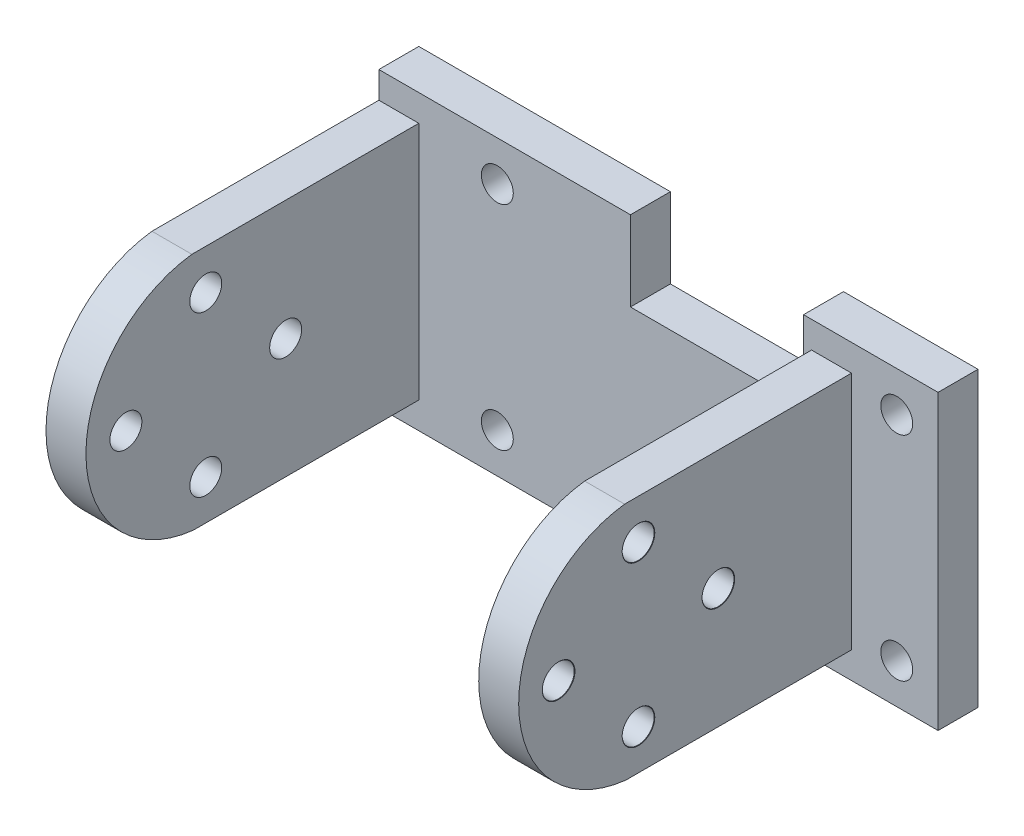
ISO-10303-21;
HEADER;
FILE_DESCRIPTION(('STEP AP214'),'2;1');
FILE_NAME('part.step','',(''),(''),'','','');
FILE_SCHEMA(('AUTOMOTIVE_DESIGN { 1 0 10303 214 1 1 1 1 }'));
ENDSEC;
DATA;
#1=APPLICATION_CONTEXT('core data for automotive mechanical design processes');
#2=APPLICATION_PROTOCOL_DEFINITION('international standard','automotive_design',2000,#1);
#3=PRODUCT_CONTEXT('',#1,'mechanical');
#4=PRODUCT('Part','Part','',(#3));
#5=PRODUCT_RELATED_PRODUCT_CATEGORY('part','',(#4));
#6=PRODUCT_DEFINITION_FORMATION('','',#4);
#7=PRODUCT_DEFINITION_CONTEXT('part definition',#1,'design');
#8=PRODUCT_DEFINITION('design','',#6,#7);
#9=PRODUCT_DEFINITION_SHAPE('','',#8);
#10=(LENGTH_UNIT() NAMED_UNIT(*) SI_UNIT(.MILLI.,.METRE.));
#11=(NAMED_UNIT(*) PLANE_ANGLE_UNIT() SI_UNIT($,.RADIAN.));
#12=(NAMED_UNIT(*) SI_UNIT($,.STERADIAN.) SOLID_ANGLE_UNIT());
#13=UNCERTAINTY_MEASURE_WITH_UNIT(LENGTH_MEASURE(1.E-05),#10,'distance_accuracy_value','');
#14=(GEOMETRIC_REPRESENTATION_CONTEXT(3) GLOBAL_UNCERTAINTY_ASSIGNED_CONTEXT((#13)) GLOBAL_UNIT_ASSIGNED_CONTEXT((#10,
#11,#12)) REPRESENTATION_CONTEXT('',''));
#15=CARTESIAN_POINT('',(0.,0.,0.));
#16=DIRECTION('',(0.,0.,1.));
#17=DIRECTION('',(1.,0.,0.));
#18=AXIS2_PLACEMENT_3D('',#15,#16,#17);
#19=CARTESIAN_POINT('',(0.,0.,47.8925602150341));
#20=DIRECTION('',(0.,0.,1.));
#21=DIRECTION('',(1.,0.,0.));
#22=AXIS2_PLACEMENT_3D('',#19,#20,#21);
#23=PLANE('',#22);
#24=CARTESIAN_POINT('',(-3.35332332496428,230.214980721309,47.8925602150341));
#25=DIRECTION('',(0.,0.,1.));
#26=DIRECTION('',(1.,0.,0.));
#27=AXIS2_PLACEMENT_3D('',#24,#25,#26);
#28=CIRCLE('',#27,1.2);
#29=CARTESIAN_POINT('',(-2.15332332496428,230.214980721309,47.8925602150341));
#30=VERTEX_POINT('',#29);
#31=EDGE_CURVE('E883',#30,#30,#28,.T.);
#32=ORIENTED_EDGE('',*,*,#31,.F.);
#33=EDGE_LOOP('',(#32));
#34=FACE_BOUND('',#33,.T.);
#35=CARTESIAN_POINT('',(-3.35332332496428,214.214980721309,47.8925602150341));
#36=DIRECTION('',(0.,0.,1.));
#37=DIRECTION('',(1.,0.,0.));
#38=AXIS2_PLACEMENT_3D('',#35,#36,#37);
#39=CIRCLE('',#38,1.2);
#40=CARTESIAN_POINT('',(-2.15332332496428,214.214980721309,47.8925602150341));
#41=VERTEX_POINT('',#40);
#42=EDGE_CURVE('E885',#41,#41,#39,.T.);
#43=ORIENTED_EDGE('',*,*,#42,.F.);
#44=EDGE_LOOP('',(#43));
#45=FACE_BOUND('',#44,.T.);
#46=CARTESIAN_POINT('',(26.6466766750357,214.214980721309,47.8925602150341));
#47=DIRECTION('',(0.,0.,1.));
#48=DIRECTION('',(1.,0.,0.));
#49=AXIS2_PLACEMENT_3D('',#46,#47,#48);
#50=CIRCLE('',#49,1.2);
#51=CARTESIAN_POINT('',(27.8466766750357,214.214980721309,47.8925602150341));
#52=VERTEX_POINT('',#51);
#53=EDGE_CURVE('E893',#52,#52,#50,.T.);
#54=ORIENTED_EDGE('',*,*,#53,.F.);
#55=EDGE_LOOP('',(#54));
#56=FACE_BOUND('',#55,.T.);
#57=CARTESIAN_POINT('',(26.6466766750357,230.214980721309,47.8925602150341));
#58=DIRECTION('',(0.,0.,1.));
#59=DIRECTION('',(1.,0.,0.));
#60=AXIS2_PLACEMENT_3D('',#57,#58,#59);
#61=CIRCLE('',#60,1.2);
#62=CARTESIAN_POINT('',(27.8466766750357,230.214980721309,47.8925602150341));
#63=VERTEX_POINT('',#62);
#64=EDGE_CURVE('E899',#63,#63,#61,.T.);
#65=ORIENTED_EDGE('',*,*,#64,.F.);
#66=EDGE_LOOP('',(#65));
#67=FACE_BOUND('',#66,.T.);
#68=DIRECTION('',(-1.,0.,0.));
#69=VECTOR('',#68,1.);
#70=CARTESIAN_POINT('',(-9.25000000000138,231.222621224414,47.892560215033));
#71=LINE('',#70,#69);
#72=CARTESIAN_POINT('',(-9.25000000000138,231.222621224414,47.892560215033));
#73=VERTEX_POINT('',#72);
#74=CARTESIAN_POINT('',(-12.2500000000014,231.222621224414,47.8925602150328));
#75=VERTEX_POINT('',#74);
#76=EDGE_CURVE('E243',#73,#75,#71,.T.);
#77=ORIENTED_EDGE('',*,*,#76,.F.);
#78=DIRECTION('',(0.,-1.,0.));
#79=VECTOR('',#78,1.);
#80=CARTESIAN_POINT('',(-9.25000000000138,231.222621224414,47.892560215033));
#81=LINE('',#80,#79);
#82=CARTESIAN_POINT('',(-9.25000000000138,213.222621224414,47.892560215033));
#83=VERTEX_POINT('',#82);
#84=EDGE_CURVE('E223',#73,#83,#81,.T.);
#85=ORIENTED_EDGE('',*,*,#84,.T.);
#86=DIRECTION('',(-1.,0.,0.));
#87=VECTOR('',#86,1.);
#88=CARTESIAN_POINT('',(-9.25000000000138,213.222621224414,47.892560215033));
#89=LINE('',#88,#87);
#90=CARTESIAN_POINT('',(-12.2500000000014,213.222621224414,47.8925602150341));
#91=VERTEX_POINT('',#90);
#92=EDGE_CURVE('E240',#83,#91,#89,.T.);
#93=ORIENTED_EDGE('',*,*,#92,.T.);
#94=DIRECTION('',(0.,-1.,0.));
#95=VECTOR('',#94,1.);
#96=CARTESIAN_POINT('',(-12.2500000000014,233.222621224414,47.8925602150341));
#97=LINE('',#96,#95);
#98=CARTESIAN_POINT('',(-12.2500000000014,211.222621224414,47.8925602150341));
#99=VERTEX_POINT('',#98);
#100=EDGE_CURVE('E320',#91,#99,#97,.T.);
#101=ORIENTED_EDGE('',*,*,#100,.T.);
#102=DIRECTION('',(1.,0.,0.));
#103=VECTOR('',#102,1.);
#104=CARTESIAN_POINT('',(-12.2500000000014,211.222621224414,47.8925602150341));
#105=LINE('',#104,#103);
#106=CARTESIAN_POINT('',(6.64667667503779,211.222621224414,47.8925602150365));
#107=VERTEX_POINT('',#106);
#108=EDGE_CURVE('E302',#99,#107,#105,.T.);
#109=ORIENTED_EDGE('',*,*,#108,.T.);
#110=DIRECTION('',(0.,1.,0.));
#111=VECTOR('',#110,1.);
#112=CARTESIAN_POINT('',(6.64667667503779,211.222621224414,47.8925602150365));
#113=LINE('',#112,#111);
#114=CARTESIAN_POINT('',(6.64667667503779,217.222621224414,47.8925602150341));
#115=VERTEX_POINT('',#114);
#116=EDGE_CURVE('E249',#107,#115,#113,.T.);
#117=ORIENTED_EDGE('',*,*,#116,.T.);
#118=DIRECTION('',(1.,0.,0.));
#119=VECTOR('',#118,1.);
#120=CARTESIAN_POINT('',(6.64667667503779,217.222621224414,47.8925602150365));
#121=LINE('',#120,#119);
#122=CARTESIAN_POINT('',(19.6466766750378,217.222621224414,47.8925602150371));
#123=VERTEX_POINT('',#122);
#124=EDGE_CURVE('E253',#115,#123,#121,.T.);
#125=ORIENTED_EDGE('',*,*,#124,.T.);
#126=DIRECTION('',(0.,-1.,0.));
#127=VECTOR('',#126,1.);
#128=CARTESIAN_POINT('',(19.6466766750378,217.222621224414,47.8925602150371));
#129=LINE('',#128,#127);
#130=CARTESIAN_POINT('',(19.6466766750378,211.222621224414,47.8925602150371));
#131=VERTEX_POINT('',#130);
#132=EDGE_CURVE('E246',#123,#131,#129,.T.);
#133=ORIENTED_EDGE('',*,*,#132,.T.);
#134=CARTESIAN_POINT('',(29.7499999999986,211.222621224414,47.8925602150341));
#135=VERTEX_POINT('',#134);
#136=EDGE_CURVE('E324',#131,#135,#105,.T.);
#137=ORIENTED_EDGE('',*,*,#136,.T.);
#138=DIRECTION('',(0.,1.,0.));
#139=VECTOR('',#138,1.);
#140=CARTESIAN_POINT('',(29.7499999999986,211.222621224414,47.8925602150341));
#141=LINE('',#140,#139);
#142=CARTESIAN_POINT('',(29.7499999999986,233.222621224414,47.8925602150341));
#143=VERTEX_POINT('',#142);
#144=EDGE_CURVE('E291',#135,#143,#141,.T.);
#145=ORIENTED_EDGE('',*,*,#144,.T.);
#146=DIRECTION('',(-1.,0.,0.));
#147=VECTOR('',#146,1.);
#148=CARTESIAN_POINT('',(29.7499999999986,233.222621224414,47.8925602150341));
#149=LINE('',#148,#147);
#150=CARTESIAN_POINT('',(19.6466766750378,233.222621224414,47.8925602150356));
#151=VERTEX_POINT('',#150);
#152=EDGE_CURVE('E317',#143,#151,#149,.T.);
#153=ORIENTED_EDGE('',*,*,#152,.T.);
#154=DIRECTION('',(0.,-1.,0.));
#155=VECTOR('',#154,1.);
#156=CARTESIAN_POINT('',(19.6466766750378,233.222621224414,47.8925602150356));
#157=LINE('',#156,#155);
#158=CARTESIAN_POINT('',(19.6466766750378,227.222621224414,47.8925602150341));
#159=VERTEX_POINT('',#158);
#160=EDGE_CURVE('E275',#151,#159,#157,.T.);
#161=ORIENTED_EDGE('',*,*,#160,.T.);
#162=DIRECTION('',(-1.,0.,0.));
#163=VECTOR('',#162,1.);
#164=CARTESIAN_POINT('',(19.6466766750378,227.222621224414,47.8925602150356));
#165=LINE('',#164,#163);
#166=CARTESIAN_POINT('',(6.64667667503779,227.222621224414,47.892560215035));
#167=VERTEX_POINT('',#166);
#168=EDGE_CURVE('E279',#159,#167,#165,.T.);
#169=ORIENTED_EDGE('',*,*,#168,.T.);
#170=DIRECTION('',(0.,1.,0.));
#171=VECTOR('',#170,1.);
#172=CARTESIAN_POINT('',(6.64667667503779,227.222621224414,47.892560215035));
#173=LINE('',#172,#171);
#174=CARTESIAN_POINT('',(6.64667667503779,233.222621224414,47.892560215035));
#175=VERTEX_POINT('',#174);
#176=EDGE_CURVE('E272',#167,#175,#173,.T.);
#177=ORIENTED_EDGE('',*,*,#176,.T.);
#178=CARTESIAN_POINT('',(-12.2500000000014,233.222621224414,47.8925602150341));
#179=VERTEX_POINT('',#178);
#180=EDGE_CURVE('E316',#175,#179,#149,.T.);
#181=ORIENTED_EDGE('',*,*,#180,.T.);
#182=EDGE_CURVE('E321',#179,#75,#97,.T.);
#183=ORIENTED_EDGE('',*,*,#182,.T.);
#184=EDGE_LOOP('',(#77,#85,#93,#101,#109,#117,#125,#133,#137,#145,#153,#161,#169,#177,#181,#183));
#185=FACE_BOUND('',#184,.T.);
#186=DIRECTION('',(1.,0.,0.));
#187=VECTOR('',#186,1.);
#188=CARTESIAN_POINT('',(20.2500000000005,213.222621224414,47.8925602150345));
#189=LINE('',#188,#187);
#190=CARTESIAN_POINT('',(20.2500000000005,213.222621224414,47.8925602150341));
#191=VERTEX_POINT('',#190);
#192=CARTESIAN_POINT('',(23.2500000000005,213.222621224414,47.8925602150341));
#193=VERTEX_POINT('',#192);
#194=EDGE_CURVE('E59',#191,#193,#189,.T.);
#195=ORIENTED_EDGE('',*,*,#194,.F.);
#196=DIRECTION('',(0.,1.,0.));
#197=VECTOR('',#196,1.);
#198=CARTESIAN_POINT('',(20.2500000000005,213.222621224414,47.8925602150345));
#199=LINE('',#198,#197);
#200=CARTESIAN_POINT('',(20.2500000000005,231.222621224414,47.8925602150341));
#201=VERTEX_POINT('',#200);
#202=EDGE_CURVE('E54',#191,#201,#199,.T.);
#203=ORIENTED_EDGE('',*,*,#202,.T.);
#204=DIRECTION('',(1.,0.,0.));
#205=VECTOR('',#204,1.);
#206=CARTESIAN_POINT('',(20.2500000000005,231.222621224414,47.8925602150345));
#207=LINE('',#206,#205);
#208=CARTESIAN_POINT('',(23.2500000000005,231.222621224414,47.8925602150345));
#209=VERTEX_POINT('',#208);
#210=EDGE_CURVE('E213',#201,#209,#207,.T.);
#211=ORIENTED_EDGE('',*,*,#210,.T.);
#212=DIRECTION('',(0.,1.,0.));
#213=VECTOR('',#212,1.);
#214=CARTESIAN_POINT('',(23.2500000000005,213.222621224414,47.8925602150345));
#215=LINE('',#214,#213);
#216=EDGE_CURVE('E198',#193,#209,#215,.T.);
#217=ORIENTED_EDGE('',*,*,#216,.F.);
#218=EDGE_LOOP('',(#195,#203,#211,#217));
#219=FACE_BOUND('',#218,.T.);
#220=ADVANCED_FACE('F37',(#34,#45,#56,#67,#185,#219),#23,.T.);
#221=CARTESIAN_POINT('',(-12.2500000000014,211.222621224414,44.8925602150341));
#222=DIRECTION('',(0.,-1.,0.));
#223=DIRECTION('',(0.,0.,-1.));
#224=AXIS2_PLACEMENT_3D('',#221,#222,#223);
#225=PLANE('',#224);
#226=DIRECTION('',(0.,0.,-1.));
#227=VECTOR('',#226,1.);
#228=CARTESIAN_POINT('',(19.6466766750378,211.222621224414,47.8925602150371));
#229=LINE('',#228,#227);
#230=CARTESIAN_POINT('',(19.6466766750379,211.222621224414,44.8925602150343));
#231=VERTEX_POINT('',#230);
#232=EDGE_CURVE('E256',#131,#231,#229,.T.);
#233=ORIENTED_EDGE('',*,*,#232,.T.);
#234=DIRECTION('',(1.,0.,0.));
#235=VECTOR('',#234,1.);
#236=CARTESIAN_POINT('',(-12.2500000000014,211.222621224414,44.8925602150341));
#237=LINE('',#236,#235);
#238=CARTESIAN_POINT('',(29.7499999999986,211.222621224414,44.8925602150341));
#239=VERTEX_POINT('',#238);
#240=EDGE_CURVE('E309',#231,#239,#237,.T.);
#241=ORIENTED_EDGE('',*,*,#240,.T.);
#242=DIRECTION('',(0.,0.,1.));
#243=VECTOR('',#242,1.);
#244=CARTESIAN_POINT('',(29.7499999999986,211.222621224414,44.8925602150341));
#245=LINE('',#244,#243);
#246=EDGE_CURVE('E11',#239,#135,#245,.T.);
#247=ORIENTED_EDGE('',*,*,#246,.T.);
#248=ORIENTED_EDGE('',*,*,#136,.F.);
#249=EDGE_LOOP('',(#233,#241,#247,#248));
#250=FACE_BOUND('',#249,.T.);
#251=ADVANCED_FACE('F426',(#250),#225,.T.);
#252=CARTESIAN_POINT('',(29.7499999999986,233.222621224414,44.8925602150341));
#253=DIRECTION('',(0.,1.,0.));
#254=DIRECTION('',(0.,0.,1.));
#255=AXIS2_PLACEMENT_3D('',#252,#253,#254);
#256=PLANE('',#255);
#257=DIRECTION('',(0.,0.,-1.));
#258=VECTOR('',#257,1.);
#259=CARTESIAN_POINT('',(6.64667667503779,233.222621224414,47.892560215035));
#260=LINE('',#259,#258);
#261=CARTESIAN_POINT('',(6.64667667503792,233.222621224414,44.8925602150337));
#262=VERTEX_POINT('',#261);
#263=EDGE_CURVE('E282',#175,#262,#260,.T.);
#264=ORIENTED_EDGE('',*,*,#263,.T.);
#265=DIRECTION('',(-1.,0.,0.));
#266=VECTOR('',#265,1.);
#267=CARTESIAN_POINT('',(29.7499999999986,233.222621224414,44.8925602150341));
#268=LINE('',#267,#266);
#269=CARTESIAN_POINT('',(-12.2500000000014,233.222621224414,44.8925602150341));
#270=VERTEX_POINT('',#269);
#271=EDGE_CURVE('E301',#262,#270,#268,.T.);
#272=ORIENTED_EDGE('',*,*,#271,.T.);
#273=DIRECTION('',(0.,0.,1.));
#274=VECTOR('',#273,1.);
#275=CARTESIAN_POINT('',(-12.2500000000014,233.222621224414,44.8925602150341));
#276=LINE('',#275,#274);
#277=EDGE_CURVE('E329',#270,#179,#276,.T.);
#278=ORIENTED_EDGE('',*,*,#277,.T.);
#279=ORIENTED_EDGE('',*,*,#180,.F.);
#280=EDGE_LOOP('',(#264,#272,#278,#279));
#281=FACE_BOUND('',#280,.T.);
#282=ADVANCED_FACE('F452',(#281),#256,.T.);
#283=CARTESIAN_POINT('',(29.7499999999986,211.222621224414,44.8925602150341));
#284=DIRECTION('',(1.,0.,0.));
#285=DIRECTION('',(0.,0.,-1.));
#286=AXIS2_PLACEMENT_3D('',#283,#284,#285);
#287=PLANE('',#286);
#288=ORIENTED_EDGE('',*,*,#144,.F.);
#289=ORIENTED_EDGE('',*,*,#246,.F.);
#290=DIRECTION('',(0.,1.,0.));
#291=VECTOR('',#290,1.);
#292=CARTESIAN_POINT('',(29.7499999999986,211.222621224414,44.8925602150341));
#293=LINE('',#292,#291);
#294=CARTESIAN_POINT('',(29.7499999999986,233.222621224414,44.8925602150341));
#295=VERTEX_POINT('',#294);
#296=EDGE_CURVE('E298',#239,#295,#293,.T.);
#297=ORIENTED_EDGE('',*,*,#296,.T.);
#298=DIRECTION('',(0.,0.,1.));
#299=VECTOR('',#298,1.);
#300=CARTESIAN_POINT('',(29.7499999999986,233.222621224414,44.8925602150341));
#301=LINE('',#300,#299);
#302=EDGE_CURVE('E313',#295,#143,#301,.T.);
#303=ORIENTED_EDGE('',*,*,#302,.T.);
#304=EDGE_LOOP('',(#288,#289,#297,#303));
#305=FACE_BOUND('',#304,.T.);
#306=ADVANCED_FACE('F39',(#305),#287,.T.);
#307=DIRECTION('',(0.,0.,-1.));
#308=VECTOR('',#307,1.);
#309=CARTESIAN_POINT('',(6.64667667503779,211.222621224414,47.8925602150365));
#310=LINE('',#309,#308);
#311=CARTESIAN_POINT('',(6.64667667503792,211.222621224414,44.8925602150337));
#312=VERTEX_POINT('',#311);
#313=EDGE_CURVE('E268',#107,#312,#310,.T.);
#314=ORIENTED_EDGE('',*,*,#313,.F.);
#315=ORIENTED_EDGE('',*,*,#108,.F.);
#316=DIRECTION('',(0.,0.,1.));
#317=VECTOR('',#316,1.);
#318=CARTESIAN_POINT('',(-12.2500000000014,211.222621224414,44.8925602150341));
#319=LINE('',#318,#317);
#320=CARTESIAN_POINT('',(-12.2500000000014,211.222621224414,44.8925602150341));
#321=VERTEX_POINT('',#320);
#322=EDGE_CURVE('E46',#321,#99,#319,.T.);
#323=ORIENTED_EDGE('',*,*,#322,.F.);
#324=EDGE_CURVE('E310',#321,#312,#237,.T.);
#325=ORIENTED_EDGE('',*,*,#324,.T.);
#326=EDGE_LOOP('',(#314,#315,#323,#325));
#327=FACE_BOUND('',#326,.T.);
#328=ADVANCED_FACE('F412',(#327),#225,.T.);
#329=CARTESIAN_POINT('',(-12.2500000000014,233.222621224414,44.8925602150341));
#330=DIRECTION('',(-1.,0.,0.));
#331=DIRECTION('',(0.,0.,1.));
#332=AXIS2_PLACEMENT_3D('',#329,#330,#331);
#333=PLANE('',#332);
#334=CARTESIAN_POINT('',(-12.2500000000022,228.22222330115,63.8927591766666));
#335=DIRECTION('',(1.,0.,0.));
#336=DIRECTION('',(0.,0.,-1.));
#337=AXIS2_PLACEMENT_3D('',#334,#335,#336);
#338=CIRCLE('',#337,1.20000000000001);
#339=CARTESIAN_POINT('',(-12.2500000000022,228.22222330115,62.6927591766666));
#340=VERTEX_POINT('',#339);
#341=EDGE_CURVE('E911',#340,#340,#338,.T.);
#342=ORIENTED_EDGE('',*,*,#341,.T.);
#343=EDGE_LOOP('',(#342));
#344=FACE_BOUND('',#343,.T.);
#345=CARTESIAN_POINT('',(-12.2500000000022,222.222422262782,69.8925602150345));
#346=DIRECTION('',(1.,0.,0.));
#347=DIRECTION('',(0.,0.,-1.));
#348=AXIS2_PLACEMENT_3D('',#345,#346,#347);
#349=CIRCLE('',#348,1.20000000000001);
#350=CARTESIAN_POINT('',(-12.2500000000022,222.222422262782,68.6925602150345));
#351=VERTEX_POINT('',#350);
#352=EDGE_CURVE('E344',#351,#351,#349,.T.);
#353=ORIENTED_EDGE('',*,*,#352,.T.);
#354=EDGE_LOOP('',(#353));
#355=FACE_BOUND('',#354,.T.);
#356=CARTESIAN_POINT('',(-12.2500000000022,216.222621224414,63.8927591766666));
#357=DIRECTION('',(1.,0.,0.));
#358=DIRECTION('',(0.,0.,-1.));
#359=AXIS2_PLACEMENT_3D('',#356,#357,#358);
#360=CIRCLE('',#359,1.20000000000001);
#361=CARTESIAN_POINT('',(-12.2500000000022,216.222621224414,62.6927591766666));
#362=VERTEX_POINT('',#361);
#363=EDGE_CURVE('E340',#362,#362,#360,.T.);
#364=ORIENTED_EDGE('',*,*,#363,.T.);
#365=EDGE_LOOP('',(#364));
#366=FACE_BOUND('',#365,.T.);
#367=CARTESIAN_POINT('',(-12.2500000000022,222.222422262782,57.8929581382988));
#368=DIRECTION('',(1.,0.,0.));
#369=DIRECTION('',(0.,0.,-1.));
#370=AXIS2_PLACEMENT_3D('',#367,#368,#369);
#371=CIRCLE('',#370,1.20000000000001);
#372=CARTESIAN_POINT('',(-12.2500000000022,222.222422262782,56.6929581382988));
#373=VERTEX_POINT('',#372);
#374=EDGE_CURVE('E336',#373,#373,#371,.T.);
#375=ORIENTED_EDGE('',*,*,#374,.T.);
#376=EDGE_LOOP('',(#375));
#377=FACE_BOUND('',#376,.T.);
#378=ORIENTED_EDGE('',*,*,#182,.F.);
#379=ORIENTED_EDGE('',*,*,#277,.F.);
#380=DIRECTION('',(0.,-1.,0.));
#381=VECTOR('',#380,1.);
#382=CARTESIAN_POINT('',(-12.2500000000014,233.222621224414,44.8925602150341));
#383=LINE('',#382,#381);
#384=EDGE_CURVE('E306',#270,#321,#383,.T.);
#385=ORIENTED_EDGE('',*,*,#384,.T.);
#386=ORIENTED_EDGE('',*,*,#322,.T.);
#387=ORIENTED_EDGE('',*,*,#100,.F.);
#388=DIRECTION('',(0.,0.,1.));
#389=VECTOR('',#388,1.);
#390=CARTESIAN_POINT('',(-12.2500000000014,213.222621224414,47.8925602150329));
#391=LINE('',#390,#389);
#392=CARTESIAN_POINT('',(-12.2500000000022,213.222621224414,64.8394862931623));
#393=VERTEX_POINT('',#392);
#394=EDGE_CURVE('E220',#91,#393,#391,.T.);
#395=ORIENTED_EDGE('',*,*,#394,.T.);
#396=CARTESIAN_POINT('',(-12.2500000000021,222.228271681865,63.8305728769531));
#397=DIRECTION('',(-1.,0.,0.));
#398=DIRECTION('',(0.,0.,1.));
#399=AXIS2_PLACEMENT_3D('',#396,#397,#398);
#400=CIRCLE('',#399,9.06198909970577);
#401=CARTESIAN_POINT('',(-12.2500000000022,231.222621224414,64.9357075970785));
#402=VERTEX_POINT('',#401);
#403=EDGE_CURVE('E212',#393,#402,#400,.T.);
#404=ORIENTED_EDGE('',*,*,#403,.T.);
#405=DIRECTION('',(0.,0.,-1.));
#406=VECTOR('',#405,1.);
#407=CARTESIAN_POINT('',(-12.2500000000022,231.222621224414,64.9357075970785));
#408=LINE('',#407,#406);
#409=EDGE_CURVE('E232',#402,#75,#408,.T.);
#410=ORIENTED_EDGE('',*,*,#409,.T.);
#411=EDGE_LOOP('',(#378,#379,#385,#386,#387,#395,#404,#410));
#412=FACE_BOUND('',#411,.T.);
#413=ADVANCED_FACE('F377',(#344,#355,#366,#377,#412),#333,.T.);
#414=DIRECTION('',(0.,0.,-1.));
#415=VECTOR('',#414,1.);
#416=CARTESIAN_POINT('',(19.6466766750378,233.222621224414,47.8925602150356));
#417=LINE('',#416,#415);
#418=CARTESIAN_POINT('',(19.6466766750379,233.222621224414,44.8925602150343));
#419=VERTEX_POINT('',#418);
#420=EDGE_CURVE('E294',#151,#419,#417,.T.);
#421=ORIENTED_EDGE('',*,*,#420,.F.);
#422=ORIENTED_EDGE('',*,*,#152,.F.);
#423=ORIENTED_EDGE('',*,*,#302,.F.);
#424=EDGE_CURVE('E303',#295,#419,#268,.T.);
#425=ORIENTED_EDGE('',*,*,#424,.T.);
#426=EDGE_LOOP('',(#421,#422,#423,#425));
#427=FACE_BOUND('',#426,.T.);
#428=ADVANCED_FACE('F435',(#427),#256,.T.);
#429=CARTESIAN_POINT('',(0.,0.,44.8925602150341));
#430=DIRECTION('',(0.,0.,1.));
#431=DIRECTION('',(1.,0.,0.));
#432=AXIS2_PLACEMENT_3D('',#429,#430,#431);
#433=PLANE('',#432);
#434=CARTESIAN_POINT('',(-3.35332332496428,230.214980721309,44.8925602150337));
#435=DIRECTION('',(0.,0.,1.));
#436=DIRECTION('',(1.,0.,0.));
#437=AXIS2_PLACEMENT_3D('',#434,#435,#436);
#438=CIRCLE('',#437,1.2);
#439=CARTESIAN_POINT('',(-2.15332332496428,230.214980721309,44.8925602150337));
#440=VERTEX_POINT('',#439);
#441=EDGE_CURVE('E881',#440,#440,#438,.T.);
#442=ORIENTED_EDGE('',*,*,#441,.T.);
#443=EDGE_LOOP('',(#442));
#444=FACE_BOUND('',#443,.T.);
#445=CARTESIAN_POINT('',(-3.35332332496428,214.214980721309,44.8925602150337));
#446=DIRECTION('',(0.,0.,1.));
#447=DIRECTION('',(1.,0.,0.));
#448=AXIS2_PLACEMENT_3D('',#445,#446,#447);
#449=CIRCLE('',#448,1.2);
#450=CARTESIAN_POINT('',(-2.15332332496428,214.214980721309,44.8925602150337));
#451=VERTEX_POINT('',#450);
#452=EDGE_CURVE('E890',#451,#451,#449,.T.);
#453=ORIENTED_EDGE('',*,*,#452,.T.);
#454=EDGE_LOOP('',(#453));
#455=FACE_BOUND('',#454,.T.);
#456=CARTESIAN_POINT('',(26.6466766750357,214.214980721309,44.8925602150337));
#457=DIRECTION('',(0.,0.,1.));
#458=DIRECTION('',(1.,0.,0.));
#459=AXIS2_PLACEMENT_3D('',#456,#457,#458);
#460=CIRCLE('',#459,1.2);
#461=CARTESIAN_POINT('',(27.8466766750357,214.214980721309,44.8925602150337));
#462=VERTEX_POINT('',#461);
#463=EDGE_CURVE('E896',#462,#462,#460,.T.);
#464=ORIENTED_EDGE('',*,*,#463,.T.);
#465=EDGE_LOOP('',(#464));
#466=FACE_BOUND('',#465,.T.);
#467=CARTESIAN_POINT('',(26.6466766750357,230.214980721309,44.8925602150337));
#468=DIRECTION('',(0.,0.,1.));
#469=DIRECTION('',(1.,0.,0.));
#470=AXIS2_PLACEMENT_3D('',#467,#468,#469);
#471=CIRCLE('',#470,1.2);
#472=CARTESIAN_POINT('',(27.8466766750357,230.214980721309,44.8925602150337));
#473=VERTEX_POINT('',#472);
#474=EDGE_CURVE('E902',#473,#473,#471,.T.);
#475=ORIENTED_EDGE('',*,*,#474,.T.);
#476=EDGE_LOOP('',(#475));
#477=FACE_BOUND('',#476,.T.);
#478=ORIENTED_EDGE('',*,*,#240,.F.);
#479=DIRECTION('',(0.,-1.,0.));
#480=VECTOR('',#479,1.);
#481=CARTESIAN_POINT('',(19.6466766750379,217.222621224414,44.8925602150343));
#482=LINE('',#481,#480);
#483=CARTESIAN_POINT('',(19.6466766750379,217.222621224414,44.8925602150343));
#484=VERTEX_POINT('',#483);
#485=EDGE_CURVE('E239',#484,#231,#482,.T.);
#486=ORIENTED_EDGE('',*,*,#485,.F.);
#487=DIRECTION('',(1.,0.,0.));
#488=VECTOR('',#487,1.);
#489=CARTESIAN_POINT('',(6.64667667503792,217.222621224414,44.8925602150337));
#490=LINE('',#489,#488);
#491=CARTESIAN_POINT('',(6.64667667503792,217.222621224414,44.8925602150337));
#492=VERTEX_POINT('',#491);
#493=EDGE_CURVE('E250',#492,#484,#490,.T.);
#494=ORIENTED_EDGE('',*,*,#493,.F.);
#495=DIRECTION('',(0.,1.,0.));
#496=VECTOR('',#495,1.);
#497=CARTESIAN_POINT('',(6.64667667503792,211.222621224414,44.8925602150337));
#498=LINE('',#497,#496);
#499=EDGE_CURVE('E258',#312,#492,#498,.T.);
#500=ORIENTED_EDGE('',*,*,#499,.F.);
#501=ORIENTED_EDGE('',*,*,#324,.F.);
#502=ORIENTED_EDGE('',*,*,#384,.F.);
#503=ORIENTED_EDGE('',*,*,#271,.F.);
#504=DIRECTION('',(0.,1.,0.));
#505=VECTOR('',#504,1.);
#506=CARTESIAN_POINT('',(6.64667667503792,227.222621224414,44.8925602150337));
#507=LINE('',#506,#505);
#508=CARTESIAN_POINT('',(6.64667667503792,227.222621224414,44.8925602150337));
#509=VERTEX_POINT('',#508);
#510=EDGE_CURVE('E265',#509,#262,#507,.T.);
#511=ORIENTED_EDGE('',*,*,#510,.F.);
#512=DIRECTION('',(-1.,0.,0.));
#513=VECTOR('',#512,1.);
#514=CARTESIAN_POINT('',(19.6466766750379,227.222621224414,44.8925602150343));
#515=LINE('',#514,#513);
#516=CARTESIAN_POINT('',(19.6466766750379,227.222621224414,44.8925602150343));
#517=VERTEX_POINT('',#516);
#518=EDGE_CURVE('E276',#517,#509,#515,.T.);
#519=ORIENTED_EDGE('',*,*,#518,.F.);
#520=DIRECTION('',(0.,-1.,0.));
#521=VECTOR('',#520,1.);
#522=CARTESIAN_POINT('',(19.6466766750379,233.222621224414,44.8925602150343));
#523=LINE('',#522,#521);
#524=EDGE_CURVE('E284',#419,#517,#523,.T.);
#525=ORIENTED_EDGE('',*,*,#524,.F.);
#526=ORIENTED_EDGE('',*,*,#424,.F.);
#527=ORIENTED_EDGE('',*,*,#296,.F.);
#528=EDGE_LOOP('',(#478,#486,#494,#500,#501,#502,#503,#511,#519,#525,#526,#527));
#529=FACE_BOUND('',#528,.T.);
#530=ADVANCED_FACE('F443',(#444,#455,#466,#477,#529),#433,.F.);
#531=CARTESIAN_POINT('',(6.64667667503779,227.222621224414,47.892560215035));
#532=DIRECTION('',(-1.,0.,0.));
#533=DIRECTION('',(0.,0.,1.));
#534=AXIS2_PLACEMENT_3D('',#531,#532,#533);
#535=PLANE('',#534);
#536=ORIENTED_EDGE('',*,*,#510,.T.);
#537=ORIENTED_EDGE('',*,*,#263,.F.);
#538=ORIENTED_EDGE('',*,*,#176,.F.);
#539=DIRECTION('',(0.,0.,-1.));
#540=VECTOR('',#539,1.);
#541=CARTESIAN_POINT('',(6.64667667503779,227.222621224414,47.892560215035));
#542=LINE('',#541,#540);
#543=EDGE_CURVE('E289',#167,#509,#542,.T.);
#544=ORIENTED_EDGE('',*,*,#543,.T.);
#545=EDGE_LOOP('',(#536,#537,#538,#544));
#546=FACE_BOUND('',#545,.T.);
#547=ADVANCED_FACE('F485',(#546),#535,.F.);
#548=CARTESIAN_POINT('',(19.6466766750378,227.222621224414,47.8925602150356));
#549=DIRECTION('',(0.,-1.,0.));
#550=DIRECTION('',(0.,0.,-1.));
#551=AXIS2_PLACEMENT_3D('',#548,#549,#550);
#552=PLANE('',#551);
#553=ORIENTED_EDGE('',*,*,#518,.T.);
#554=ORIENTED_EDGE('',*,*,#543,.F.);
#555=ORIENTED_EDGE('',*,*,#168,.F.);
#556=DIRECTION('',(0.,0.,-1.));
#557=VECTOR('',#556,1.);
#558=CARTESIAN_POINT('',(19.6466766750378,227.222621224414,47.8925602150356));
#559=LINE('',#558,#557);
#560=EDGE_CURVE('E292',#159,#517,#559,.T.);
#561=ORIENTED_EDGE('',*,*,#560,.T.);
#562=EDGE_LOOP('',(#553,#554,#555,#561));
#563=FACE_BOUND('',#562,.T.);
#564=ADVANCED_FACE('F447',(#563),#552,.F.);
#565=CARTESIAN_POINT('',(19.6466766750378,233.222621224414,47.8925602150356));
#566=DIRECTION('',(1.,0.,0.));
#567=DIRECTION('',(0.,0.,-1.));
#568=AXIS2_PLACEMENT_3D('',#565,#566,#567);
#569=PLANE('',#568);
#570=ORIENTED_EDGE('',*,*,#524,.T.);
#571=ORIENTED_EDGE('',*,*,#560,.F.);
#572=ORIENTED_EDGE('',*,*,#160,.F.);
#573=ORIENTED_EDGE('',*,*,#420,.T.);
#574=EDGE_LOOP('',(#570,#571,#572,#573));
#575=FACE_BOUND('',#574,.T.);
#576=ADVANCED_FACE('F439',(#575),#569,.F.);
#577=CARTESIAN_POINT('',(19.6466766750378,217.222621224414,47.8925602150371));
#578=DIRECTION('',(1.,0.,0.));
#579=DIRECTION('',(0.,0.,-1.));
#580=AXIS2_PLACEMENT_3D('',#577,#578,#579);
#581=PLANE('',#580);
#582=ORIENTED_EDGE('',*,*,#485,.T.);
#583=ORIENTED_EDGE('',*,*,#232,.F.);
#584=ORIENTED_EDGE('',*,*,#132,.F.);
#585=DIRECTION('',(0.,0.,-1.));
#586=VECTOR('',#585,1.);
#587=CARTESIAN_POINT('',(19.6466766750378,217.222621224414,47.8925602150371));
#588=LINE('',#587,#586);
#589=EDGE_CURVE('E263',#123,#484,#588,.T.);
#590=ORIENTED_EDGE('',*,*,#589,.T.);
#591=EDGE_LOOP('',(#582,#583,#584,#590));
#592=FACE_BOUND('',#591,.T.);
#593=ADVANCED_FACE('F423',(#592),#581,.F.);
#594=CARTESIAN_POINT('',(6.64667667503779,217.222621224414,47.8925602150365));
#595=DIRECTION('',(0.,1.,0.));
#596=DIRECTION('',(0.,0.,1.));
#597=AXIS2_PLACEMENT_3D('',#594,#595,#596);
#598=PLANE('',#597);
#599=ORIENTED_EDGE('',*,*,#493,.T.);
#600=ORIENTED_EDGE('',*,*,#589,.F.);
#601=ORIENTED_EDGE('',*,*,#124,.F.);
#602=DIRECTION('',(0.,0.,-1.));
#603=VECTOR('',#602,1.);
#604=CARTESIAN_POINT('',(6.64667667503779,217.222621224414,47.8925602150365));
#605=LINE('',#604,#603);
#606=EDGE_CURVE('E266',#115,#492,#605,.T.);
#607=ORIENTED_EDGE('',*,*,#606,.T.);
#608=EDGE_LOOP('',(#599,#600,#601,#607));
#609=FACE_BOUND('',#608,.T.);
#610=ADVANCED_FACE('F419',(#609),#598,.F.);
#611=CARTESIAN_POINT('',(6.64667667503779,211.222621224414,47.8925602150365));
#612=DIRECTION('',(-1.,0.,0.));
#613=DIRECTION('',(0.,0.,1.));
#614=AXIS2_PLACEMENT_3D('',#611,#612,#613);
#615=PLANE('',#614);
#616=ORIENTED_EDGE('',*,*,#499,.T.);
#617=ORIENTED_EDGE('',*,*,#606,.F.);
#618=ORIENTED_EDGE('',*,*,#116,.F.);
#619=ORIENTED_EDGE('',*,*,#313,.T.);
#620=EDGE_LOOP('',(#616,#617,#618,#619));
#621=FACE_BOUND('',#620,.T.);
#622=ADVANCED_FACE('F415',(#621),#615,.F.);
#623=CARTESIAN_POINT('',(-9.25000000000211,222.228271681865,63.8305728769533));
#624=DIRECTION('',(-1.,0.,0.));
#625=DIRECTION('',(0.,0.,1.));
#626=AXIS2_PLACEMENT_3D('',#623,#624,#625);
#627=CYLINDRICAL_SURFACE('',#626,9.06198909970577);
#628=ORIENTED_EDGE('',*,*,#403,.F.);
#629=DIRECTION('',(-1.,0.,0.));
#630=VECTOR('',#629,1.);
#631=CARTESIAN_POINT('',(-9.25000000000216,213.222621224414,64.8394862931624));
#632=LINE('',#631,#630);
#633=CARTESIAN_POINT('',(-9.25000000000216,213.222621224414,64.8394862931624));
#634=VERTEX_POINT('',#633);
#635=EDGE_CURVE('E237',#634,#393,#632,.T.);
#636=ORIENTED_EDGE('',*,*,#635,.F.);
#637=CARTESIAN_POINT('',(-9.25000000000211,222.228271681865,63.8305728769533));
#638=DIRECTION('',(-1.,0.,0.));
#639=DIRECTION('',(0.,0.,1.));
#640=AXIS2_PLACEMENT_3D('',#637,#638,#639);
#641=CIRCLE('',#640,9.06198909970577);
#642=CARTESIAN_POINT('',(-9.25000000000216,231.222621224414,64.9357075970787));
#643=VERTEX_POINT('',#642);
#644=EDGE_CURVE('E216',#634,#643,#641,.T.);
#645=ORIENTED_EDGE('',*,*,#644,.T.);
#646=DIRECTION('',(-1.,0.,0.));
#647=VECTOR('',#646,1.);
#648=CARTESIAN_POINT('',(-9.25000000000216,231.222621224414,64.9357075970787));
#649=LINE('',#648,#647);
#650=EDGE_CURVE('E229',#643,#402,#649,.T.);
#651=ORIENTED_EDGE('',*,*,#650,.T.);
#652=EDGE_LOOP('',(#628,#636,#645,#651));
#653=FACE_BOUND('',#652,.T.);
#654=ADVANCED_FACE('F455',(#653),#627,.T.);
#655=CARTESIAN_POINT('',(-9.25000000000138,213.222621224414,47.892560215033));
#656=DIRECTION('',(0.,-1.,0.));
#657=DIRECTION('',(0.,0.,-1.));
#658=AXIS2_PLACEMENT_3D('',#655,#656,#657);
#659=PLANE('',#658);
#660=ORIENTED_EDGE('',*,*,#394,.F.);
#661=ORIENTED_EDGE('',*,*,#92,.F.);
#662=DIRECTION('',(0.,0.,1.));
#663=VECTOR('',#662,1.);
#664=CARTESIAN_POINT('',(-9.25000000000138,213.222621224414,47.892560215033));
#665=LINE('',#664,#663);
#666=EDGE_CURVE('E226',#83,#634,#665,.T.);
#667=ORIENTED_EDGE('',*,*,#666,.T.);
#668=ORIENTED_EDGE('',*,*,#635,.T.);
#669=EDGE_LOOP('',(#660,#661,#667,#668));
#670=FACE_BOUND('',#669,.T.);
#671=ADVANCED_FACE('F400',(#670),#659,.T.);
#672=CARTESIAN_POINT('',(-9.25000000000216,231.222621224414,64.9357075970787));
#673=DIRECTION('',(0.,1.,0.));
#674=DIRECTION('',(0.,0.,1.));
#675=AXIS2_PLACEMENT_3D('',#672,#673,#674);
#676=PLANE('',#675);
#677=ORIENTED_EDGE('',*,*,#409,.F.);
#678=ORIENTED_EDGE('',*,*,#650,.F.);
#679=DIRECTION('',(0.,0.,-1.));
#680=VECTOR('',#679,1.);
#681=CARTESIAN_POINT('',(-9.25000000000216,231.222621224414,64.9357075970787));
#682=LINE('',#681,#680);
#683=EDGE_CURVE('E219',#643,#73,#682,.T.);
#684=ORIENTED_EDGE('',*,*,#683,.T.);
#685=ORIENTED_EDGE('',*,*,#76,.T.);
#686=EDGE_LOOP('',(#677,#678,#684,#685));
#687=FACE_BOUND('',#686,.T.);
#688=ADVANCED_FACE('F392',(#687),#676,.T.);
#689=CARTESIAN_POINT('',(-9.25000000000211,222.228271681865,63.8305728769533));
#690=DIRECTION('',(-1.,0.,0.));
#691=DIRECTION('',(0.,0.,1.));
#692=AXIS2_PLACEMENT_3D('',#689,#690,#691);
#693=PLANE('',#692);
#694=CARTESIAN_POINT('',(-9.25000000000211,228.22222330115,63.8927591766666));
#695=DIRECTION('',(-1.,0.,0.));
#696=DIRECTION('',(0.,0.,1.));
#697=AXIS2_PLACEMENT_3D('',#694,#695,#696);
#698=CIRCLE('',#697,1.20000000000001);
#699=CARTESIAN_POINT('',(-9.25000000000217,228.22222330115,65.0927591766666));
#700=VERTEX_POINT('',#699);
#701=EDGE_CURVE('E914',#700,#700,#698,.T.);
#702=ORIENTED_EDGE('',*,*,#701,.T.);
#703=EDGE_LOOP('',(#702));
#704=FACE_BOUND('',#703,.T.);
#705=CARTESIAN_POINT('',(-9.25000000000239,222.222422262782,69.8925602150345));
#706=DIRECTION('',(-1.,0.,0.));
#707=DIRECTION('',(0.,0.,1.));
#708=AXIS2_PLACEMENT_3D('',#705,#706,#707);
#709=CIRCLE('',#708,1.20000000000001);
#710=CARTESIAN_POINT('',(-9.25000000000244,222.222422262782,71.0925602150345));
#711=VERTEX_POINT('',#710);
#712=EDGE_CURVE('E343',#711,#711,#709,.T.);
#713=ORIENTED_EDGE('',*,*,#712,.T.);
#714=EDGE_LOOP('',(#713));
#715=FACE_BOUND('',#714,.T.);
#716=CARTESIAN_POINT('',(-9.25000000000211,216.222621224414,63.8927591766666));
#717=DIRECTION('',(-1.,0.,0.));
#718=DIRECTION('',(0.,0.,1.));
#719=AXIS2_PLACEMENT_3D('',#716,#717,#718);
#720=CIRCLE('',#719,1.20000000000001);
#721=CARTESIAN_POINT('',(-9.25000000000217,216.222621224414,65.0927591766666));
#722=VERTEX_POINT('',#721);
#723=EDGE_CURVE('E339',#722,#722,#720,.T.);
#724=ORIENTED_EDGE('',*,*,#723,.T.);
#725=EDGE_LOOP('',(#724));
#726=FACE_BOUND('',#725,.T.);
#727=CARTESIAN_POINT('',(-9.25000000000184,222.222422262782,57.8929581382988));
#728=DIRECTION('',(-1.,0.,0.));
#729=DIRECTION('',(0.,0.,1.));
#730=AXIS2_PLACEMENT_3D('',#727,#728,#729);
#731=CIRCLE('',#730,1.20000000000001);
#732=CARTESIAN_POINT('',(-9.2500000000019,222.222422262782,59.0929581382988));
#733=VERTEX_POINT('',#732);
#734=EDGE_CURVE('E201',#733,#733,#731,.T.);
#735=ORIENTED_EDGE('',*,*,#734,.T.);
#736=EDGE_LOOP('',(#735));
#737=FACE_BOUND('',#736,.T.);
#738=ORIENTED_EDGE('',*,*,#644,.F.);
#739=ORIENTED_EDGE('',*,*,#666,.F.);
#740=ORIENTED_EDGE('',*,*,#84,.F.);
#741=ORIENTED_EDGE('',*,*,#683,.F.);
#742=EDGE_LOOP('',(#738,#739,#740,#741));
#743=FACE_BOUND('',#742,.T.);
#744=ADVANCED_FACE('F389',(#704,#715,#726,#737,#743),#693,.F.);
#745=CARTESIAN_POINT('',(20.2500000000005,222.228271681865,63.8305728769548));
#746=DIRECTION('',(1.,0.,0.));
#747=DIRECTION('',(0.,0.,-1.));
#748=AXIS2_PLACEMENT_3D('',#745,#746,#747);
#749=CYLINDRICAL_SURFACE('',#748,9.06198909970577);
#750=CARTESIAN_POINT('',(23.2500000000005,222.228271681865,63.8305728769548));
#751=DIRECTION('',(1.,0.,0.));
#752=DIRECTION('',(0.,0.,-1.));
#753=AXIS2_PLACEMENT_3D('',#750,#751,#752);
#754=CIRCLE('',#753,9.06198909970577);
#755=CARTESIAN_POINT('',(23.2500000000005,231.222621224414,64.9357075970802));
#756=VERTEX_POINT('',#755);
#757=CARTESIAN_POINT('',(23.2500000000005,213.222621224414,64.8394862931639));
#758=VERTEX_POINT('',#757);
#759=EDGE_CURVE('E206',#756,#758,#754,.T.);
#760=ORIENTED_EDGE('',*,*,#759,.F.);
#761=DIRECTION('',(1.,0.,0.));
#762=VECTOR('',#761,1.);
#763=CARTESIAN_POINT('',(20.2500000000005,231.222621224414,64.9357075970802));
#764=LINE('',#763,#762);
#765=CARTESIAN_POINT('',(20.2500000000005,231.222621224414,64.9357075970802));
#766=VERTEX_POINT('',#765);
#767=EDGE_CURVE('E194',#766,#756,#764,.T.);
#768=ORIENTED_EDGE('',*,*,#767,.F.);
#769=CARTESIAN_POINT('',(20.2500000000005,222.228271681865,63.8305728769548));
#770=DIRECTION('',(1.,0.,0.));
#771=DIRECTION('',(0.,0.,-1.));
#772=AXIS2_PLACEMENT_3D('',#769,#770,#771);
#773=CIRCLE('',#772,9.06198909970577);
#774=CARTESIAN_POINT('',(20.2500000000005,213.222621224414,64.8394862931639));
#775=VERTEX_POINT('',#774);
#776=EDGE_CURVE('E190',#766,#775,#773,.T.);
#777=ORIENTED_EDGE('',*,*,#776,.T.);
#778=DIRECTION('',(1.,0.,0.));
#779=VECTOR('',#778,1.);
#780=CARTESIAN_POINT('',(20.2500000000005,213.222621224414,64.8394862931639));
#781=LINE('',#780,#779);
#782=EDGE_CURVE('E174',#775,#758,#781,.T.);
#783=ORIENTED_EDGE('',*,*,#782,.T.);
#784=EDGE_LOOP('',(#760,#768,#777,#783));
#785=FACE_BOUND('',#784,.T.);
#786=ADVANCED_FACE('F193',(#785),#749,.T.);
#787=CARTESIAN_POINT('',(20.2500000000005,231.222621224414,47.8925602150345));
#788=DIRECTION('',(0.,1.,0.));
#789=DIRECTION('',(0.,0.,1.));
#790=AXIS2_PLACEMENT_3D('',#787,#788,#789);
#791=PLANE('',#790);
#792=DIRECTION('',(0.,0.,1.));
#793=VECTOR('',#792,1.);
#794=CARTESIAN_POINT('',(23.2500000000005,231.222621224414,47.8925602150345));
#795=LINE('',#794,#793);
#796=EDGE_CURVE('E195',#209,#756,#795,.T.);
#797=ORIENTED_EDGE('',*,*,#796,.F.);
#798=ORIENTED_EDGE('',*,*,#210,.F.);
#799=DIRECTION('',(0.,0.,1.));
#800=VECTOR('',#799,1.);
#801=CARTESIAN_POINT('',(20.2500000000005,231.222621224414,47.8925602150345));
#802=LINE('',#801,#800);
#803=EDGE_CURVE('E184',#201,#766,#802,.T.);
#804=ORIENTED_EDGE('',*,*,#803,.T.);
#805=ORIENTED_EDGE('',*,*,#767,.T.);
#806=EDGE_LOOP('',(#797,#798,#804,#805));
#807=FACE_BOUND('',#806,.T.);
#808=ADVANCED_FACE('F748',(#807),#791,.T.);
#809=CARTESIAN_POINT('',(20.2500000000005,213.222621224414,64.8394862931639));
#810=DIRECTION('',(0.,-1.,0.));
#811=DIRECTION('',(0.,0.,-1.));
#812=AXIS2_PLACEMENT_3D('',#809,#810,#811);
#813=PLANE('',#812);
#814=DIRECTION('',(0.,0.,-1.));
#815=VECTOR('',#814,1.);
#816=CARTESIAN_POINT('',(23.2500000000005,213.222621224414,64.8394862931639));
#817=LINE('',#816,#815);
#818=EDGE_CURVE('E179',#758,#193,#817,.T.);
#819=ORIENTED_EDGE('',*,*,#818,.F.);
#820=ORIENTED_EDGE('',*,*,#782,.F.);
#821=DIRECTION('',(0.,0.,-1.));
#822=VECTOR('',#821,1.);
#823=CARTESIAN_POINT('',(20.2500000000005,213.222621224414,64.8394862931639));
#824=LINE('',#823,#822);
#825=EDGE_CURVE('E177',#775,#191,#824,.T.);
#826=ORIENTED_EDGE('',*,*,#825,.T.);
#827=ORIENTED_EDGE('',*,*,#194,.T.);
#828=EDGE_LOOP('',(#819,#820,#826,#827));
#829=FACE_BOUND('',#828,.T.);
#830=ADVANCED_FACE('F176',(#829),#813,.T.);
#831=CARTESIAN_POINT('',(20.2500000000005,222.228271681865,63.8305728769548));
#832=DIRECTION('',(1.,0.,0.));
#833=DIRECTION('',(0.,0.,-1.));
#834=AXIS2_PLACEMENT_3D('',#831,#832,#833);
#835=PLANE('',#834);
#836=CARTESIAN_POINT('',(20.2500000000005,228.22222330115,63.8927591766666));
#837=DIRECTION('',(1.,0.,0.));
#838=DIRECTION('',(0.,0.,-1.));
#839=AXIS2_PLACEMENT_3D('',#836,#837,#838);
#840=CIRCLE('',#839,1.20000000000001);
#841=CARTESIAN_POINT('',(20.2500000000005,228.22222330115,62.6927591766666));
#842=VERTEX_POINT('',#841);
#843=EDGE_CURVE('E41',#842,#842,#840,.T.);
#844=ORIENTED_EDGE('',*,*,#843,.T.);
#845=EDGE_LOOP('',(#844));
#846=FACE_BOUND('',#845,.T.);
#847=CARTESIAN_POINT('',(20.2500000000005,222.222422262782,69.8925602150345));
#848=DIRECTION('',(1.,0.,0.));
#849=DIRECTION('',(0.,0.,-1.));
#850=AXIS2_PLACEMENT_3D('',#847,#848,#849);
#851=CIRCLE('',#850,1.20000000000001);
#852=CARTESIAN_POINT('',(20.2500000000005,222.222422262782,68.6925602150345));
#853=VERTEX_POINT('',#852);
#854=EDGE_CURVE('E341',#853,#853,#851,.T.);
#855=ORIENTED_EDGE('',*,*,#854,.T.);
#856=EDGE_LOOP('',(#855));
#857=FACE_BOUND('',#856,.T.);
#858=CARTESIAN_POINT('',(20.2500000000005,216.222621224414,63.8927591766666));
#859=DIRECTION('',(1.,0.,0.));
#860=DIRECTION('',(0.,0.,-1.));
#861=AXIS2_PLACEMENT_3D('',#858,#859,#860);
#862=CIRCLE('',#861,1.20000000000001);
#863=CARTESIAN_POINT('',(20.2500000000005,216.222621224414,62.6927591766666));
#864=VERTEX_POINT('',#863);
#865=EDGE_CURVE('E337',#864,#864,#862,.T.);
#866=ORIENTED_EDGE('',*,*,#865,.T.);
#867=EDGE_LOOP('',(#866));
#868=FACE_BOUND('',#867,.T.);
#869=CARTESIAN_POINT('',(20.2500000000005,222.222422262782,57.8929581382988));
#870=DIRECTION('',(1.,0.,0.));
#871=DIRECTION('',(0.,0.,-1.));
#872=AXIS2_PLACEMENT_3D('',#869,#870,#871);
#873=CIRCLE('',#872,1.20000000000001);
#874=CARTESIAN_POINT('',(20.2500000000005,222.222422262782,56.6929581382988));
#875=VERTEX_POINT('',#874);
#876=EDGE_CURVE('E333',#875,#875,#873,.T.);
#877=ORIENTED_EDGE('',*,*,#876,.T.);
#878=EDGE_LOOP('',(#877));
#879=FACE_BOUND('',#878,.T.);
#880=ORIENTED_EDGE('',*,*,#776,.F.);
#881=ORIENTED_EDGE('',*,*,#803,.F.);
#882=ORIENTED_EDGE('',*,*,#202,.F.);
#883=ORIENTED_EDGE('',*,*,#825,.F.);
#884=EDGE_LOOP('',(#880,#881,#882,#883));
#885=FACE_BOUND('',#884,.T.);
#886=ADVANCED_FACE('F188',(#846,#857,#868,#879,#885),#835,.F.);
#887=CARTESIAN_POINT('',(23.2500000000005,222.228271681865,63.8305728769548));
#888=DIRECTION('',(1.,0.,0.));
#889=DIRECTION('',(0.,0.,-1.));
#890=AXIS2_PLACEMENT_3D('',#887,#888,#889);
#891=PLANE('',#890);
#892=CARTESIAN_POINT('',(23.2500000000005,228.22222330115,63.8927591766666));
#893=DIRECTION('',(1.,0.,0.));
#894=DIRECTION('',(0.,0.,-1.));
#895=AXIS2_PLACEMENT_3D('',#892,#893,#894);
#896=CIRCLE('',#895,1.225);
#897=CARTESIAN_POINT('',(23.2500000000005,228.22222330115,62.6677591766666));
#898=VERTEX_POINT('',#897);
#899=EDGE_CURVE('E905',#898,#898,#896,.T.);
#900=ORIENTED_EDGE('',*,*,#899,.F.);
#901=EDGE_LOOP('',(#900));
#902=FACE_BOUND('',#901,.T.);
#903=CARTESIAN_POINT('',(23.2500000000005,222.222422262782,69.8925602150345));
#904=DIRECTION('',(1.,0.,0.));
#905=DIRECTION('',(0.,0.,-1.));
#906=AXIS2_PLACEMENT_3D('',#903,#904,#905);
#907=CIRCLE('',#906,1.225);
#908=CARTESIAN_POINT('',(23.2500000000005,222.222422262782,68.6675602150345));
#909=VERTEX_POINT('',#908);
#910=EDGE_CURVE('E356',#909,#909,#907,.T.);
#911=ORIENTED_EDGE('',*,*,#910,.F.);
#912=EDGE_LOOP('',(#911));
#913=FACE_BOUND('',#912,.T.);
#914=CARTESIAN_POINT('',(23.2500000000005,216.222621224414,63.8927591766666));
#915=DIRECTION('',(1.,0.,0.));
#916=DIRECTION('',(0.,0.,-1.));
#917=AXIS2_PLACEMENT_3D('',#914,#915,#916);
#918=CIRCLE('',#917,1.225);
#919=CARTESIAN_POINT('',(23.2500000000005,216.222621224414,62.6677591766666));
#920=VERTEX_POINT('',#919);
#921=EDGE_CURVE('E348',#920,#920,#918,.T.);
#922=ORIENTED_EDGE('',*,*,#921,.F.);
#923=EDGE_LOOP('',(#922));
#924=FACE_BOUND('',#923,.T.);
#925=CARTESIAN_POINT('',(23.2500000000005,222.222422262782,57.8929581382988));
#926=DIRECTION('',(1.,0.,0.));
#927=DIRECTION('',(0.,0.,-1.));
#928=AXIS2_PLACEMENT_3D('',#925,#926,#927);
#929=CIRCLE('',#928,1.225);
#930=CARTESIAN_POINT('',(23.2500000000005,222.222422262782,56.6679581382988));
#931=VERTEX_POINT('',#930);
#932=EDGE_CURVE('E369',#931,#931,#929,.T.);
#933=ORIENTED_EDGE('',*,*,#932,.F.);
#934=EDGE_LOOP('',(#933));
#935=FACE_BOUND('',#934,.T.);
#936=ORIENTED_EDGE('',*,*,#759,.T.);
#937=ORIENTED_EDGE('',*,*,#818,.T.);
#938=ORIENTED_EDGE('',*,*,#216,.T.);
#939=ORIENTED_EDGE('',*,*,#796,.T.);
#940=EDGE_LOOP('',(#936,#937,#938,#939));
#941=FACE_BOUND('',#940,.T.);
#942=ADVANCED_FACE('F531',(#902,#913,#924,#935,#941),#891,.T.);
#943=CARTESIAN_POINT('',(23.2500000000005,222.222422262782,57.8929581382988));
#944=DIRECTION('',(1.,0.,0.));
#945=DIRECTION('',(0.,0.,-1.));
#946=AXIS2_PLACEMENT_3D('',#943,#944,#945);
#947=CONICAL_SURFACE('',#946,1.225,0.785398163397379);
#948=CARTESIAN_POINT('',(23.2250000000005,222.222422262782,57.8929581382988));
#949=DIRECTION('',(1.,0.,0.));
#950=DIRECTION('',(0.,0.,-1.));
#951=AXIS2_PLACEMENT_3D('',#948,#949,#950);
#952=CIRCLE('',#951,1.20000000000001);
#953=CARTESIAN_POINT('',(23.2250000000005,222.222422262782,56.6929581382988));
#954=VERTEX_POINT('',#953);
#955=EDGE_CURVE('E372',#954,#954,#952,.T.);
#956=ORIENTED_EDGE('',*,*,#955,.F.);
#957=EDGE_LOOP('',(#956));
#958=FACE_BOUND('',#957,.T.);
#959=ORIENTED_EDGE('',*,*,#932,.T.);
#960=EDGE_LOOP('',(#959));
#961=FACE_BOUND('',#960,.T.);
#962=ADVANCED_FACE('F542',(#958,#961),#947,.F.);
#963=CARTESIAN_POINT('',(23.2500000000005,222.222422262782,57.8929581382988));
#964=DIRECTION('',(1.,0.,0.));
#965=DIRECTION('',(0.,0.,-1.));
#966=AXIS2_PLACEMENT_3D('',#963,#964,#965);
#967=CYLINDRICAL_SURFACE('',#966,1.20000000000001);
#968=ORIENTED_EDGE('',*,*,#955,.T.);
#969=EDGE_LOOP('',(#968));
#970=FACE_BOUND('',#969,.T.);
#971=ORIENTED_EDGE('',*,*,#876,.F.);
#972=EDGE_LOOP('',(#971));
#973=FACE_BOUND('',#972,.T.);
#974=ADVANCED_FACE('F384',(#970,#973),#967,.F.);
#975=ORIENTED_EDGE('',*,*,#374,.F.);
#976=EDGE_LOOP('',(#975));
#977=FACE_BOUND('',#976,.T.);
#978=ORIENTED_EDGE('',*,*,#734,.F.);
#979=EDGE_LOOP('',(#978));
#980=FACE_BOUND('',#979,.T.);
#981=ADVANCED_FACE('F380',(#977,#980),#967,.F.);
#982=CARTESIAN_POINT('',(23.2500000000005,216.222621224414,63.8927591766666));
#983=DIRECTION('',(1.,0.,0.));
#984=DIRECTION('',(0.,0.,-1.));
#985=AXIS2_PLACEMENT_3D('',#982,#983,#984);
#986=CONICAL_SURFACE('',#985,1.225,0.785398163397379);
#987=CARTESIAN_POINT('',(23.2250000000005,216.222621224414,63.8927591766666));
#988=DIRECTION('',(1.,0.,0.));
#989=DIRECTION('',(0.,0.,-1.));
#990=AXIS2_PLACEMENT_3D('',#987,#988,#989);
#991=CIRCLE('',#990,1.20000000000001);
#992=CARTESIAN_POINT('',(23.2250000000005,216.222621224414,62.6927591766666));
#993=VERTEX_POINT('',#992);
#994=EDGE_CURVE('E362',#993,#993,#991,.T.);
#995=ORIENTED_EDGE('',*,*,#994,.F.);
#996=EDGE_LOOP('',(#995));
#997=FACE_BOUND('',#996,.T.);
#998=ORIENTED_EDGE('',*,*,#921,.T.);
#999=EDGE_LOOP('',(#998));
#1000=FACE_BOUND('',#999,.T.);
#1001=ADVANCED_FACE('F383',(#997,#1000),#986,.F.);
#1002=CARTESIAN_POINT('',(23.2500000000005,216.222621224414,63.8927591766666));
#1003=DIRECTION('',(1.,0.,0.));
#1004=DIRECTION('',(0.,0.,-1.));
#1005=AXIS2_PLACEMENT_3D('',#1002,#1003,#1004);
#1006=CYLINDRICAL_SURFACE('',#1005,1.20000000000001);
#1007=ORIENTED_EDGE('',*,*,#994,.T.);
#1008=EDGE_LOOP('',(#1007));
#1009=FACE_BOUND('',#1008,.T.);
#1010=ORIENTED_EDGE('',*,*,#865,.F.);
#1011=EDGE_LOOP('',(#1010));
#1012=FACE_BOUND('',#1011,.T.);
#1013=ADVANCED_FACE('F579',(#1009,#1012),#1006,.F.);
#1014=ORIENTED_EDGE('',*,*,#363,.F.);
#1015=EDGE_LOOP('',(#1014));
#1016=FACE_BOUND('',#1015,.T.);
#1017=ORIENTED_EDGE('',*,*,#723,.F.);
#1018=EDGE_LOOP('',(#1017));
#1019=FACE_BOUND('',#1018,.T.);
#1020=ADVANCED_FACE('F590',(#1016,#1019),#1006,.F.);
#1021=CARTESIAN_POINT('',(23.2500000000005,222.222422262782,69.8925602150345));
#1022=DIRECTION('',(1.,0.,0.));
#1023=DIRECTION('',(0.,0.,-1.));
#1024=AXIS2_PLACEMENT_3D('',#1021,#1022,#1023);
#1025=CONICAL_SURFACE('',#1024,1.225,0.785398163397379);
#1026=CARTESIAN_POINT('',(23.2250000000005,222.222422262782,69.8925602150345));
#1027=DIRECTION('',(1.,0.,0.));
#1028=DIRECTION('',(0.,0.,-1.));
#1029=AXIS2_PLACEMENT_3D('',#1026,#1027,#1028);
#1030=CIRCLE('',#1029,1.20000000000001);
#1031=CARTESIAN_POINT('',(23.2250000000005,222.222422262782,68.6925602150345));
#1032=VERTEX_POINT('',#1031);
#1033=EDGE_CURVE('E351',#1032,#1032,#1030,.T.);
#1034=ORIENTED_EDGE('',*,*,#1033,.F.);
#1035=EDGE_LOOP('',(#1034));
#1036=FACE_BOUND('',#1035,.T.);
#1037=ORIENTED_EDGE('',*,*,#910,.T.);
#1038=EDGE_LOOP('',(#1037));
#1039=FACE_BOUND('',#1038,.T.);
#1040=ADVANCED_FACE('F601',(#1036,#1039),#1025,.F.);
#1041=CARTESIAN_POINT('',(23.2500000000005,222.222422262782,69.8925602150345));
#1042=DIRECTION('',(1.,0.,0.));
#1043=DIRECTION('',(0.,0.,-1.));
#1044=AXIS2_PLACEMENT_3D('',#1041,#1042,#1043);
#1045=CYLINDRICAL_SURFACE('',#1044,1.20000000000001);
#1046=ORIENTED_EDGE('',*,*,#1033,.T.);
#1047=EDGE_LOOP('',(#1046));
#1048=FACE_BOUND('',#1047,.T.);
#1049=ORIENTED_EDGE('',*,*,#854,.F.);
#1050=EDGE_LOOP('',(#1049));
#1051=FACE_BOUND('',#1050,.T.);
#1052=ADVANCED_FACE('F611',(#1048,#1051),#1045,.F.);
#1053=ORIENTED_EDGE('',*,*,#352,.F.);
#1054=EDGE_LOOP('',(#1053));
#1055=FACE_BOUND('',#1054,.T.);
#1056=ORIENTED_EDGE('',*,*,#712,.F.);
#1057=EDGE_LOOP('',(#1056));
#1058=FACE_BOUND('',#1057,.T.);
#1059=ADVANCED_FACE('F622',(#1055,#1058),#1045,.F.);
#1060=CARTESIAN_POINT('',(23.2500000000005,228.22222330115,63.8927591766666));
#1061=DIRECTION('',(1.,0.,0.));
#1062=DIRECTION('',(0.,0.,-1.));
#1063=AXIS2_PLACEMENT_3D('',#1060,#1061,#1062);
#1064=CONICAL_SURFACE('',#1063,1.225,0.785398163397379);
#1065=CARTESIAN_POINT('',(23.2250000000005,228.22222330115,63.8927591766666));
#1066=DIRECTION('',(1.,0.,0.));
#1067=DIRECTION('',(0.,0.,-1.));
#1068=AXIS2_PLACEMENT_3D('',#1065,#1066,#1067);
#1069=CIRCLE('',#1068,1.20000000000001);
#1070=CARTESIAN_POINT('',(23.2250000000005,228.22222330115,62.6927591766666));
#1071=VERTEX_POINT('',#1070);
#1072=EDGE_CURVE('E908',#1071,#1071,#1069,.T.);
#1073=ORIENTED_EDGE('',*,*,#1072,.F.);
#1074=EDGE_LOOP('',(#1073));
#1075=FACE_BOUND('',#1074,.T.);
#1076=ORIENTED_EDGE('',*,*,#899,.T.);
#1077=EDGE_LOOP('',(#1076));
#1078=FACE_BOUND('',#1077,.T.);
#1079=ADVANCED_FACE('F633',(#1075,#1078),#1064,.F.);
#1080=CARTESIAN_POINT('',(23.2500000000005,228.22222330115,63.8927591766666));
#1081=DIRECTION('',(1.,0.,0.));
#1082=DIRECTION('',(0.,0.,-1.));
#1083=AXIS2_PLACEMENT_3D('',#1080,#1081,#1082);
#1084=CYLINDRICAL_SURFACE('',#1083,1.20000000000001);
#1085=ORIENTED_EDGE('',*,*,#1072,.T.);
#1086=EDGE_LOOP('',(#1085));
#1087=FACE_BOUND('',#1086,.T.);
#1088=ORIENTED_EDGE('',*,*,#843,.F.);
#1089=EDGE_LOOP('',(#1088));
#1090=FACE_BOUND('',#1089,.T.);
#1091=ADVANCED_FACE('F643',(#1087,#1090),#1084,.F.);
#1092=ORIENTED_EDGE('',*,*,#341,.F.);
#1093=EDGE_LOOP('',(#1092));
#1094=FACE_BOUND('',#1093,.T.);
#1095=ORIENTED_EDGE('',*,*,#701,.F.);
#1096=EDGE_LOOP('',(#1095));
#1097=FACE_BOUND('',#1096,.T.);
#1098=ADVANCED_FACE('F654',(#1094,#1097),#1084,.F.);
#1099=CARTESIAN_POINT('',(26.6466766750357,230.214980721309,47.8925602150341));
#1100=DIRECTION('',(0.,0.,1.));
#1101=DIRECTION('',(1.,0.,0.));
#1102=AXIS2_PLACEMENT_3D('',#1099,#1100,#1101);
#1103=CYLINDRICAL_SURFACE('',#1102,1.2);
#1104=ORIENTED_EDGE('',*,*,#474,.F.);
#1105=EDGE_LOOP('',(#1104));
#1106=FACE_BOUND('',#1105,.T.);
#1107=ORIENTED_EDGE('',*,*,#64,.T.);
#1108=EDGE_LOOP('',(#1107));
#1109=FACE_BOUND('',#1108,.T.);
#1110=ADVANCED_FACE('F664',(#1106,#1109),#1103,.F.);
#1111=CARTESIAN_POINT('',(26.6466766750357,214.214980721309,47.8925602150341));
#1112=DIRECTION('',(0.,0.,1.));
#1113=DIRECTION('',(1.,0.,0.));
#1114=AXIS2_PLACEMENT_3D('',#1111,#1112,#1113);
#1115=CYLINDRICAL_SURFACE('',#1114,1.2);
#1116=ORIENTED_EDGE('',*,*,#463,.F.);
#1117=EDGE_LOOP('',(#1116));
#1118=FACE_BOUND('',#1117,.T.);
#1119=ORIENTED_EDGE('',*,*,#53,.T.);
#1120=EDGE_LOOP('',(#1119));
#1121=FACE_BOUND('',#1120,.T.);
#1122=ADVANCED_FACE('F689',(#1118,#1121),#1115,.F.);
#1123=CARTESIAN_POINT('',(-3.35332332496428,214.214980721309,47.8925602150341));
#1124=DIRECTION('',(0.,0.,1.));
#1125=DIRECTION('',(1.,0.,0.));
#1126=AXIS2_PLACEMENT_3D('',#1123,#1124,#1125);
#1127=CYLINDRICAL_SURFACE('',#1126,1.2);
#1128=ORIENTED_EDGE('',*,*,#452,.F.);
#1129=EDGE_LOOP('',(#1128));
#1130=FACE_BOUND('',#1129,.T.);
#1131=ORIENTED_EDGE('',*,*,#42,.T.);
#1132=EDGE_LOOP('',(#1131));
#1133=FACE_BOUND('',#1132,.T.);
#1134=ADVANCED_FACE('F700',(#1130,#1133),#1127,.F.);
#1135=CARTESIAN_POINT('',(-3.35332332496428,230.214980721309,47.8925602150341));
#1136=DIRECTION('',(0.,0.,1.));
#1137=DIRECTION('',(1.,0.,0.));
#1138=AXIS2_PLACEMENT_3D('',#1135,#1136,#1137);
#1139=CYLINDRICAL_SURFACE('',#1138,1.2);
#1140=ORIENTED_EDGE('',*,*,#441,.F.);
#1141=EDGE_LOOP('',(#1140));
#1142=FACE_BOUND('',#1141,.T.);
#1143=ORIENTED_EDGE('',*,*,#31,.T.);
#1144=EDGE_LOOP('',(#1143));
#1145=FACE_BOUND('',#1144,.T.);
#1146=ADVANCED_FACE('F711',(#1142,#1145),#1139,.F.);
#1147=CLOSED_SHELL('',(#220,#251,#282,#306,#328,#413,#428,#530,#547,#564,#576,#593,#610,#622,
#654,#671,#688,#744,#786,#808,#830,#886,#942,#962,#974,#981,#1001,#1013,#1020,#1040,#1052,#1059,
#1079,#1091,#1098,#1110,#1122,#1134,#1146));
#1148=MANIFOLD_SOLID_BREP('B2',#1147);
#1149=ADVANCED_BREP_SHAPE_REPRESENTATION('',(#18,#1148),#14);
#1150=SHAPE_DEFINITION_REPRESENTATION(#9,#1149);
ENDSEC;
END-ISO-10303-21;
